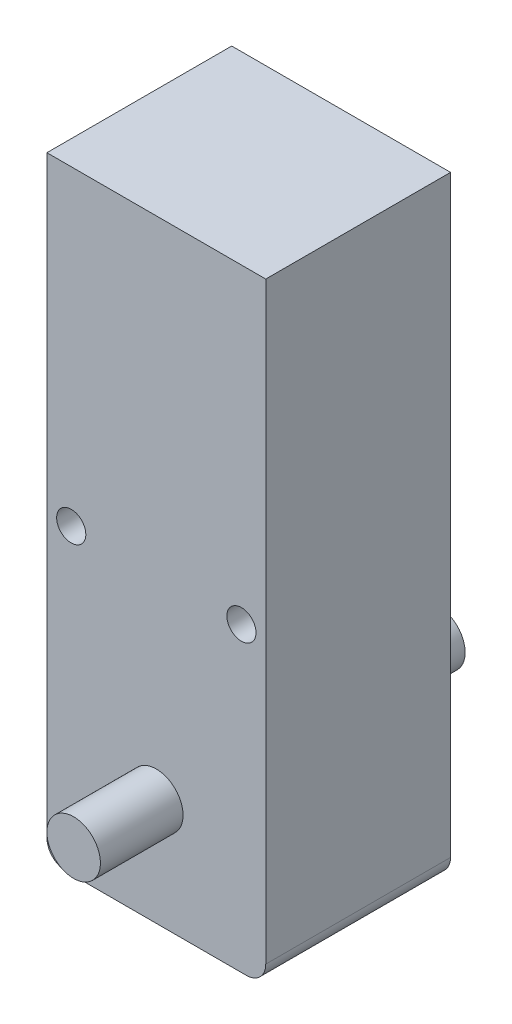
ISO-10303-21;
HEADER;
FILE_DESCRIPTION(('STEP AP214'),'2;1');
FILE_NAME('part.step','',(''),(''),'','','');
FILE_SCHEMA(('AUTOMOTIVE_DESIGN { 1 0 10303 214 1 1 1 1 }'));
ENDSEC;
DATA;
#1=APPLICATION_CONTEXT('core data for automotive mechanical design processes');
#2=APPLICATION_PROTOCOL_DEFINITION('international standard','automotive_design',2000,#1);
#3=PRODUCT_CONTEXT('',#1,'mechanical');
#4=PRODUCT('Part','Part','',(#3));
#5=PRODUCT_RELATED_PRODUCT_CATEGORY('part','',(#4));
#6=PRODUCT_DEFINITION_FORMATION('','',#4);
#7=PRODUCT_DEFINITION_CONTEXT('part definition',#1,'design');
#8=PRODUCT_DEFINITION('design','',#6,#7);
#9=PRODUCT_DEFINITION_SHAPE('','',#8);
#10=(LENGTH_UNIT() NAMED_UNIT(*) SI_UNIT(.MILLI.,.METRE.));
#11=(NAMED_UNIT(*) PLANE_ANGLE_UNIT() SI_UNIT($,.RADIAN.));
#12=(NAMED_UNIT(*) SI_UNIT($,.STERADIAN.) SOLID_ANGLE_UNIT());
#13=UNCERTAINTY_MEASURE_WITH_UNIT(LENGTH_MEASURE(1.E-05),#10,'distance_accuracy_value','');
#14=(GEOMETRIC_REPRESENTATION_CONTEXT(3) GLOBAL_UNCERTAINTY_ASSIGNED_CONTEXT((#13)) GLOBAL_UNIT_ASSIGNED_CONTEXT((#10,
#11,#12)) REPRESENTATION_CONTEXT('',''));
#15=CARTESIAN_POINT('',(0.,0.,0.));
#16=DIRECTION('',(0.,0.,1.));
#17=DIRECTION('',(1.,0.,0.));
#18=AXIS2_PLACEMENT_3D('',#15,#16,#17);
#19=CARTESIAN_POINT('',(0.,0.,0.));
#20=DIRECTION('',(0.,-1.,0.));
#21=DIRECTION('',(0.,0.,-1.));
#22=AXIS2_PLACEMENT_3D('',#19,#20,#21);
#23=PLANE('',#22);
#24=DIRECTION('',(-1.,0.,0.));
#25=VECTOR('',#24,1.);
#26=CARTESIAN_POINT('',(0.,0.,-19.));
#27=LINE('',#26,#25);
#28=CARTESIAN_POINT('',(20.5,0.,-19.));
#29=VERTEX_POINT('',#28);
#30=CARTESIAN_POINT('',(2.,0.,-19.));
#31=VERTEX_POINT('',#30);
#32=EDGE_CURVE('E161',#29,#31,#27,.T.);
#33=ORIENTED_EDGE('',*,*,#32,.F.);
#34=DIRECTION('',(0.,0.,-1.));
#35=VECTOR('',#34,1.);
#36=CARTESIAN_POINT('',(20.5,0.,0.));
#37=LINE('',#36,#35);
#38=CARTESIAN_POINT('',(20.5,0.,0.));
#39=VERTEX_POINT('',#38);
#40=EDGE_CURVE('E192',#29,#39,#37,.F.);
#41=ORIENTED_EDGE('',*,*,#40,.T.);
#42=DIRECTION('',(1.,0.,0.));
#43=VECTOR('',#42,1.);
#44=CARTESIAN_POINT('',(0.,0.,0.));
#45=LINE('',#44,#43);
#46=CARTESIAN_POINT('',(2.,0.,0.));
#47=VERTEX_POINT('',#46);
#48=EDGE_CURVE('E156',#47,#39,#45,.T.);
#49=ORIENTED_EDGE('',*,*,#48,.F.);
#50=DIRECTION('',(0.,0.,1.));
#51=VECTOR('',#50,1.);
#52=CARTESIAN_POINT('',(2.,0.,-19.));
#53=LINE('',#52,#51);
#54=EDGE_CURVE('E190',#47,#31,#53,.F.);
#55=ORIENTED_EDGE('',*,*,#54,.T.);
#56=EDGE_LOOP('',(#33,#41,#49,#55));
#57=FACE_BOUND('',#56,.T.);
#58=DIRECTION('',(1.,0.,0.));
#59=VECTOR('',#58,1.);
#60=CARTESIAN_POINT('',(8.75,0.,-10.0178180652475));
#61=LINE('',#60,#59);
#62=CARTESIAN_POINT('',(8.75,0.,-10.0178180652475));
#63=VERTEX_POINT('',#62);
#64=CARTESIAN_POINT('',(13.75,0.,-10.0178180652475));
#65=VERTEX_POINT('',#64);
#66=EDGE_CURVE('E221',#63,#65,#61,.T.);
#67=ORIENTED_EDGE('',*,*,#66,.F.);
#68=DIRECTION('',(0.,0.,-1.));
#69=VECTOR('',#68,1.);
#70=CARTESIAN_POINT('',(8.75,0.,-7.01781806524746));
#71=LINE('',#70,#69);
#72=CARTESIAN_POINT('',(8.75,0.,-7.01781806524746));
#73=VERTEX_POINT('',#72);
#74=EDGE_CURVE('E140',#73,#63,#71,.T.);
#75=ORIENTED_EDGE('',*,*,#74,.F.);
#76=DIRECTION('',(-1.,0.,0.));
#77=VECTOR('',#76,1.);
#78=CARTESIAN_POINT('',(8.75,0.,-7.01781806524746));
#79=LINE('',#78,#77);
#80=CARTESIAN_POINT('',(13.75,0.,-7.01781806524746));
#81=VERTEX_POINT('',#80);
#82=EDGE_CURVE('E136',#81,#73,#79,.T.);
#83=ORIENTED_EDGE('',*,*,#82,.F.);
#84=DIRECTION('',(0.,0.,1.));
#85=VECTOR('',#84,1.);
#86=CARTESIAN_POINT('',(13.75,0.,-7.01781806524746));
#87=LINE('',#86,#85);
#88=EDGE_CURVE('E223',#65,#81,#87,.T.);
#89=ORIENTED_EDGE('',*,*,#88,.F.);
#90=EDGE_LOOP('',(#67,#75,#83,#89));
#91=FACE_BOUND('',#90,.T.);
#92=ADVANCED_FACE('F38',(#57,#91),#23,.T.);
#93=CARTESIAN_POINT('',(0.,63.,0.));
#94=DIRECTION('',(1.,0.,0.));
#95=DIRECTION('',(0.,0.,-1.));
#96=AXIS2_PLACEMENT_3D('',#93,#94,#95);
#97=PLANE('',#96);
#98=DIRECTION('',(0.,-1.,0.));
#99=VECTOR('',#98,1.);
#100=CARTESIAN_POINT('',(0.,63.,-19.));
#101=LINE('',#100,#99);
#102=CARTESIAN_POINT('',(0.,63.,-19.));
#103=VERTEX_POINT('',#102);
#104=CARTESIAN_POINT('',(0.,2.,-19.));
#105=VERTEX_POINT('',#104);
#106=EDGE_CURVE('E167',#103,#105,#101,.T.);
#107=ORIENTED_EDGE('',*,*,#106,.T.);
#108=DIRECTION('',(0.,0.,1.));
#109=VECTOR('',#108,1.);
#110=CARTESIAN_POINT('',(0.,2.,0.));
#111=LINE('',#110,#109);
#112=CARTESIAN_POINT('',(0.,2.,0.));
#113=VERTEX_POINT('',#112);
#114=EDGE_CURVE('E11',#105,#113,#111,.T.);
#115=ORIENTED_EDGE('',*,*,#114,.T.);
#116=DIRECTION('',(0.,-1.,0.));
#117=VECTOR('',#116,1.);
#118=CARTESIAN_POINT('',(0.,63.,0.));
#119=LINE('',#118,#117);
#120=CARTESIAN_POINT('',(0.,63.,0.));
#121=VERTEX_POINT('',#120);
#122=EDGE_CURVE('E180',#121,#113,#119,.T.);
#123=ORIENTED_EDGE('',*,*,#122,.F.);
#124=DIRECTION('',(0.,0.,1.));
#125=VECTOR('',#124,1.);
#126=CARTESIAN_POINT('',(0.,63.,0.));
#127=LINE('',#126,#125);
#128=EDGE_CURVE('E157',#103,#121,#127,.T.);
#129=ORIENTED_EDGE('',*,*,#128,.F.);
#130=EDGE_LOOP('',(#107,#115,#123,#129));
#131=FACE_BOUND('',#130,.T.);
#132=ADVANCED_FACE('F243',(#131),#97,.F.);
#133=CARTESIAN_POINT('',(0.,63.,0.));
#134=DIRECTION('',(0.,0.,-1.));
#135=DIRECTION('',(-1.,0.,0.));
#136=AXIS2_PLACEMENT_3D('',#133,#134,#135);
#137=PLANE('',#136);
#138=CARTESIAN_POINT('',(20.,31.,0.));
#139=DIRECTION('',(0.,0.,1.));
#140=DIRECTION('',(1.,0.,0.));
#141=AXIS2_PLACEMENT_3D('',#138,#139,#140);
#142=CIRCLE('',#141,1.5);
#143=CARTESIAN_POINT('',(21.5,31.,0.));
#144=VERTEX_POINT('',#143);
#145=EDGE_CURVE('E203',#144,#144,#142,.T.);
#146=ORIENTED_EDGE('',*,*,#145,.F.);
#147=EDGE_LOOP('',(#146));
#148=FACE_BOUND('',#147,.T.);
#149=CARTESIAN_POINT('',(2.5,31.,0.));
#150=DIRECTION('',(0.,0.,1.));
#151=DIRECTION('',(1.,0.,0.));
#152=AXIS2_PLACEMENT_3D('',#149,#150,#151);
#153=CIRCLE('',#152,1.5);
#154=CARTESIAN_POINT('',(4.,31.,0.));
#155=VERTEX_POINT('',#154);
#156=EDGE_CURVE('E208',#155,#155,#153,.T.);
#157=ORIENTED_EDGE('',*,*,#156,.F.);
#158=EDGE_LOOP('',(#157));
#159=FACE_BOUND('',#158,.T.);
#160=CARTESIAN_POINT('',(11.25,11.,0.));
#161=DIRECTION('',(0.,0.,-1.));
#162=DIRECTION('',(-1.,0.,0.));
#163=AXIS2_PLACEMENT_3D('',#160,#161,#162);
#164=CIRCLE('',#163,2.75);
#165=CARTESIAN_POINT('',(8.5,11.,0.));
#166=VERTEX_POINT('',#165);
#167=EDGE_CURVE('E153',#166,#166,#164,.T.);
#168=ORIENTED_EDGE('',*,*,#167,.T.);
#169=EDGE_LOOP('',(#168));
#170=FACE_BOUND('',#169,.T.);
#171=ORIENTED_EDGE('',*,*,#48,.T.);
#172=CARTESIAN_POINT('',(20.5,2.,0.));
#173=DIRECTION('',(0.,0.,-1.));
#174=DIRECTION('',(-1.,0.,0.));
#175=AXIS2_PLACEMENT_3D('',#172,#173,#174);
#176=CIRCLE('',#175,2.);
#177=CARTESIAN_POINT('',(22.5,2.,0.));
#178=VERTEX_POINT('',#177);
#179=EDGE_CURVE('E47',#39,#178,#176,.F.);
#180=ORIENTED_EDGE('',*,*,#179,.T.);
#181=DIRECTION('',(0.,-1.,0.));
#182=VECTOR('',#181,1.);
#183=CARTESIAN_POINT('',(22.5,63.,0.));
#184=LINE('',#183,#182);
#185=CARTESIAN_POINT('',(22.5,63.,0.));
#186=VERTEX_POINT('',#185);
#187=EDGE_CURVE('E177',#186,#178,#184,.T.);
#188=ORIENTED_EDGE('',*,*,#187,.F.);
#189=DIRECTION('',(1.,0.,0.));
#190=VECTOR('',#189,1.);
#191=CARTESIAN_POINT('',(0.,63.,0.));
#192=LINE('',#191,#190);
#193=EDGE_CURVE('E160',#121,#186,#192,.T.);
#194=ORIENTED_EDGE('',*,*,#193,.F.);
#195=ORIENTED_EDGE('',*,*,#122,.T.);
#196=CARTESIAN_POINT('',(2.,2.,0.));
#197=DIRECTION('',(0.,0.,-1.));
#198=DIRECTION('',(-1.,0.,0.));
#199=AXIS2_PLACEMENT_3D('',#196,#197,#198);
#200=CIRCLE('',#199,2.);
#201=EDGE_CURVE('E63',#113,#47,#200,.F.);
#202=ORIENTED_EDGE('',*,*,#201,.T.);
#203=EDGE_LOOP('',(#171,#180,#188,#194,#195,#202));
#204=FACE_BOUND('',#203,.T.);
#205=ADVANCED_FACE('F249',(#148,#159,#170,#204),#137,.F.);
#206=CARTESIAN_POINT('',(22.5,63.,0.));
#207=DIRECTION('',(-1.,0.,0.));
#208=DIRECTION('',(0.,0.,1.));
#209=AXIS2_PLACEMENT_3D('',#206,#207,#208);
#210=PLANE('',#209);
#211=ORIENTED_EDGE('',*,*,#187,.T.);
#212=DIRECTION('',(0.,0.,-1.));
#213=VECTOR('',#212,1.);
#214=CARTESIAN_POINT('',(22.5,2.,-19.));
#215=LINE('',#214,#213);
#216=CARTESIAN_POINT('',(22.5,2.,-19.));
#217=VERTEX_POINT('',#216);
#218=EDGE_CURVE('E183',#178,#217,#215,.T.);
#219=ORIENTED_EDGE('',*,*,#218,.T.);
#220=DIRECTION('',(0.,-1.,0.));
#221=VECTOR('',#220,1.);
#222=CARTESIAN_POINT('',(22.5,63.,-19.));
#223=LINE('',#222,#221);
#224=CARTESIAN_POINT('',(22.5,63.,-19.));
#225=VERTEX_POINT('',#224);
#226=EDGE_CURVE('E174',#225,#217,#223,.T.);
#227=ORIENTED_EDGE('',*,*,#226,.F.);
#228=DIRECTION('',(0.,0.,-1.));
#229=VECTOR('',#228,1.);
#230=CARTESIAN_POINT('',(22.5,63.,0.));
#231=LINE('',#230,#229);
#232=EDGE_CURVE('E163',#186,#225,#231,.T.);
#233=ORIENTED_EDGE('',*,*,#232,.F.);
#234=EDGE_LOOP('',(#211,#219,#227,#233));
#235=FACE_BOUND('',#234,.T.);
#236=ADVANCED_FACE('F260',(#235),#210,.F.);
#237=CARTESIAN_POINT('',(0.,63.,-19.));
#238=DIRECTION('',(0.,0.,1.));
#239=DIRECTION('',(1.,0.,0.));
#240=AXIS2_PLACEMENT_3D('',#237,#238,#239);
#241=PLANE('',#240);
#242=CARTESIAN_POINT('',(20.,31.,-19.));
#243=DIRECTION('',(0.,0.,1.));
#244=DIRECTION('',(1.,0.,0.));
#245=AXIS2_PLACEMENT_3D('',#242,#243,#244);
#246=CIRCLE('',#245,1.5);
#247=CARTESIAN_POINT('',(21.5,31.,-19.));
#248=VERTEX_POINT('',#247);
#249=EDGE_CURVE('E42',#248,#248,#246,.T.);
#250=ORIENTED_EDGE('',*,*,#249,.T.);
#251=EDGE_LOOP('',(#250));
#252=FACE_BOUND('',#251,.T.);
#253=CARTESIAN_POINT('',(2.5,31.,-19.));
#254=DIRECTION('',(0.,0.,1.));
#255=DIRECTION('',(1.,0.,0.));
#256=AXIS2_PLACEMENT_3D('',#253,#254,#255);
#257=CIRCLE('',#256,1.5);
#258=CARTESIAN_POINT('',(4.,31.,-19.));
#259=VERTEX_POINT('',#258);
#260=EDGE_CURVE('E201',#259,#259,#257,.T.);
#261=ORIENTED_EDGE('',*,*,#260,.T.);
#262=EDGE_LOOP('',(#261));
#263=FACE_BOUND('',#262,.T.);
#264=CARTESIAN_POINT('',(11.25,11.,-19.));
#265=DIRECTION('',(0.,0.,1.));
#266=DIRECTION('',(1.,0.,0.));
#267=AXIS2_PLACEMENT_3D('',#264,#265,#266);
#268=CIRCLE('',#267,2.75);
#269=CARTESIAN_POINT('',(14.,11.,-19.));
#270=VERTEX_POINT('',#269);
#271=EDGE_CURVE('E152',#270,#270,#268,.T.);
#272=ORIENTED_EDGE('',*,*,#271,.T.);
#273=EDGE_LOOP('',(#272));
#274=FACE_BOUND('',#273,.T.);
#275=ORIENTED_EDGE('',*,*,#226,.T.);
#276=CARTESIAN_POINT('',(20.5,2.,-19.));
#277=DIRECTION('',(0.,0.,1.));
#278=DIRECTION('',(1.,0.,0.));
#279=AXIS2_PLACEMENT_3D('',#276,#277,#278);
#280=CIRCLE('',#279,2.);
#281=EDGE_CURVE('E188',#217,#29,#280,.F.);
#282=ORIENTED_EDGE('',*,*,#281,.T.);
#283=ORIENTED_EDGE('',*,*,#32,.T.);
#284=CARTESIAN_POINT('',(2.,2.,-19.));
#285=DIRECTION('',(0.,0.,1.));
#286=DIRECTION('',(1.,0.,0.));
#287=AXIS2_PLACEMENT_3D('',#284,#285,#286);
#288=CIRCLE('',#287,2.);
#289=EDGE_CURVE('E186',#31,#105,#288,.F.);
#290=ORIENTED_EDGE('',*,*,#289,.T.);
#291=ORIENTED_EDGE('',*,*,#106,.F.);
#292=DIRECTION('',(-1.,0.,0.));
#293=VECTOR('',#292,1.);
#294=CARTESIAN_POINT('',(0.,63.,-19.));
#295=LINE('',#294,#293);
#296=EDGE_CURVE('E165',#225,#103,#295,.T.);
#297=ORIENTED_EDGE('',*,*,#296,.F.);
#298=EDGE_LOOP('',(#275,#282,#283,#290,#291,#297));
#299=FACE_BOUND('',#298,.T.);
#300=ADVANCED_FACE('F257',(#252,#263,#274,#299),#241,.F.);
#301=CARTESIAN_POINT('',(0.,63.,0.));
#302=DIRECTION('',(0.,-1.,0.));
#303=DIRECTION('',(0.,0.,-1.));
#304=AXIS2_PLACEMENT_3D('',#301,#302,#303);
#305=PLANE('',#304);
#306=ORIENTED_EDGE('',*,*,#128,.T.);
#307=ORIENTED_EDGE('',*,*,#193,.T.);
#308=ORIENTED_EDGE('',*,*,#232,.T.);
#309=ORIENTED_EDGE('',*,*,#296,.T.);
#310=EDGE_LOOP('',(#306,#307,#308,#309));
#311=FACE_BOUND('',#310,.T.);
#312=ADVANCED_FACE('F255',(#311),#305,.F.);
#313=CARTESIAN_POINT('',(20.5,2.,0.));
#314=DIRECTION('',(0.,0.,1.));
#315=DIRECTION('',(1.,0.,0.));
#316=AXIS2_PLACEMENT_3D('',#313,#314,#315);
#317=CYLINDRICAL_SURFACE('',#316,2.);
#318=ORIENTED_EDGE('',*,*,#179,.F.);
#319=ORIENTED_EDGE('',*,*,#40,.F.);
#320=ORIENTED_EDGE('',*,*,#281,.F.);
#321=ORIENTED_EDGE('',*,*,#218,.F.);
#322=EDGE_LOOP('',(#318,#319,#320,#321));
#323=FACE_BOUND('',#322,.T.);
#324=ADVANCED_FACE('F267',(#323),#317,.T.);
#325=CARTESIAN_POINT('',(2.,2.,0.));
#326=DIRECTION('',(0.,0.,-1.));
#327=DIRECTION('',(-1.,0.,0.));
#328=AXIS2_PLACEMENT_3D('',#325,#326,#327);
#329=CYLINDRICAL_SURFACE('',#328,2.);
#330=ORIENTED_EDGE('',*,*,#289,.F.);
#331=ORIENTED_EDGE('',*,*,#54,.F.);
#332=ORIENTED_EDGE('',*,*,#201,.F.);
#333=ORIENTED_EDGE('',*,*,#114,.F.);
#334=EDGE_LOOP('',(#330,#331,#332,#333));
#335=FACE_BOUND('',#334,.T.);
#336=ADVANCED_FACE('F40',(#335),#329,.T.);
#337=CARTESIAN_POINT('',(11.25,11.,-29.));
#338=DIRECTION('',(0.,0.,-1.));
#339=DIRECTION('',(-1.,0.,0.));
#340=AXIS2_PLACEMENT_3D('',#337,#338,#339);
#341=PLANE('',#340);
#342=CARTESIAN_POINT('',(11.25,11.,-29.));
#343=DIRECTION('',(0.,0.,-1.));
#344=DIRECTION('',(-1.,0.,0.));
#345=AXIS2_PLACEMENT_3D('',#342,#343,#344);
#346=CIRCLE('',#345,2.75);
#347=CARTESIAN_POINT('',(8.5,11.,-29.));
#348=VERTEX_POINT('',#347);
#349=EDGE_CURVE('E142',#348,#348,#346,.T.);
#350=ORIENTED_EDGE('',*,*,#349,.T.);
#351=EDGE_LOOP('',(#350));
#352=FACE_BOUND('',#351,.T.);
#353=ADVANCED_FACE('F274',(#352),#341,.T.);
#354=CARTESIAN_POINT('',(11.25,11.,8.5));
#355=DIRECTION('',(0.,0.,-1.));
#356=DIRECTION('',(-1.,0.,0.));
#357=AXIS2_PLACEMENT_3D('',#354,#355,#356);
#358=CYLINDRICAL_SURFACE('',#357,2.75);
#359=ORIENTED_EDGE('',*,*,#349,.F.);
#360=EDGE_LOOP('',(#359));
#361=FACE_BOUND('',#360,.T.);
#362=ORIENTED_EDGE('',*,*,#271,.F.);
#363=EDGE_LOOP('',(#362));
#364=FACE_BOUND('',#363,.T.);
#365=ADVANCED_FACE('F337',(#361,#364),#358,.T.);
#366=CARTESIAN_POINT('',(11.25,11.,8.5));
#367=DIRECTION('',(0.,0.,-1.));
#368=DIRECTION('',(-1.,0.,0.));
#369=AXIS2_PLACEMENT_3D('',#366,#367,#368);
#370=CIRCLE('',#369,2.75);
#371=CARTESIAN_POINT('',(8.5,11.,8.5));
#372=VERTEX_POINT('',#371);
#373=EDGE_CURVE('E145',#372,#372,#370,.T.);
#374=ORIENTED_EDGE('',*,*,#373,.T.);
#375=EDGE_LOOP('',(#374));
#376=FACE_BOUND('',#375,.T.);
#377=ORIENTED_EDGE('',*,*,#167,.F.);
#378=EDGE_LOOP('',(#377));
#379=FACE_BOUND('',#378,.T.);
#380=ADVANCED_FACE('F347',(#376,#379),#358,.T.);
#381=CARTESIAN_POINT('',(11.25,11.,8.5));
#382=DIRECTION('',(0.,0.,-1.));
#383=DIRECTION('',(-1.,0.,0.));
#384=AXIS2_PLACEMENT_3D('',#381,#382,#383);
#385=PLANE('',#384);
#386=ORIENTED_EDGE('',*,*,#373,.F.);
#387=EDGE_LOOP('',(#386));
#388=FACE_BOUND('',#387,.T.);
#389=ADVANCED_FACE('F356',(#388),#385,.F.);
#390=CARTESIAN_POINT('',(8.75,-6.,-7.01781806524746));
#391=DIRECTION('',(1.,0.,0.));
#392=DIRECTION('',(0.,0.,-1.));
#393=AXIS2_PLACEMENT_3D('',#390,#391,#392);
#394=PLANE('',#393);
#395=ORIENTED_EDGE('',*,*,#74,.T.);
#396=DIRECTION('',(0.,1.,0.));
#397=VECTOR('',#396,1.);
#398=CARTESIAN_POINT('',(8.75,-6.,-10.0178180652475));
#399=LINE('',#398,#397);
#400=CARTESIAN_POINT('',(8.75,-6.,-10.0178180652475));
#401=VERTEX_POINT('',#400);
#402=EDGE_CURVE('E121',#401,#63,#399,.T.);
#403=ORIENTED_EDGE('',*,*,#402,.F.);
#404=DIRECTION('',(0.,0.,-1.));
#405=VECTOR('',#404,1.);
#406=CARTESIAN_POINT('',(8.75,-6.,-7.01781806524746));
#407=LINE('',#406,#405);
#408=CARTESIAN_POINT('',(8.75,-6.,-7.01781806524746));
#409=VERTEX_POINT('',#408);
#410=EDGE_CURVE('E128',#409,#401,#407,.T.);
#411=ORIENTED_EDGE('',*,*,#410,.F.);
#412=DIRECTION('',(0.,1.,0.));
#413=VECTOR('',#412,1.);
#414=CARTESIAN_POINT('',(8.75,-6.,-7.01781806524746));
#415=LINE('',#414,#413);
#416=EDGE_CURVE('E219',#409,#73,#415,.T.);
#417=ORIENTED_EDGE('',*,*,#416,.T.);
#418=EDGE_LOOP('',(#395,#403,#411,#417));
#419=FACE_BOUND('',#418,.T.);
#420=ADVANCED_FACE('F138',(#419),#394,.F.);
#421=CARTESIAN_POINT('',(8.75,-6.,-10.0178180652475));
#422=DIRECTION('',(0.,0.,1.));
#423=DIRECTION('',(1.,0.,0.));
#424=AXIS2_PLACEMENT_3D('',#421,#422,#423);
#425=PLANE('',#424);
#426=CARTESIAN_POINT('',(11.25,-3.,-10.0178180652475));
#427=DIRECTION('',(0.,0.,-1.));
#428=DIRECTION('',(-1.,0.,0.));
#429=AXIS2_PLACEMENT_3D('',#426,#427,#428);
#430=CIRCLE('',#429,1.5);
#431=CARTESIAN_POINT('',(9.74999999999999,-3.,-10.0178180652475));
#432=VERTEX_POINT('',#431);
#433=EDGE_CURVE('E200',#432,#432,#430,.T.);
#434=ORIENTED_EDGE('',*,*,#433,.F.);
#435=EDGE_LOOP('',(#434));
#436=FACE_BOUND('',#435,.T.);
#437=ORIENTED_EDGE('',*,*,#66,.T.);
#438=DIRECTION('',(0.,1.,0.));
#439=VECTOR('',#438,1.);
#440=CARTESIAN_POINT('',(13.75,-6.,-10.0178180652475));
#441=LINE('',#440,#439);
#442=CARTESIAN_POINT('',(13.75,-6.,-10.0178180652475));
#443=VERTEX_POINT('',#442);
#444=EDGE_CURVE('E124',#443,#65,#441,.T.);
#445=ORIENTED_EDGE('',*,*,#444,.F.);
#446=DIRECTION('',(1.,0.,0.));
#447=VECTOR('',#446,1.);
#448=CARTESIAN_POINT('',(8.75,-6.,-10.0178180652475));
#449=LINE('',#448,#447);
#450=EDGE_CURVE('E117',#401,#443,#449,.T.);
#451=ORIENTED_EDGE('',*,*,#450,.F.);
#452=ORIENTED_EDGE('',*,*,#402,.T.);
#453=EDGE_LOOP('',(#437,#445,#451,#452));
#454=FACE_BOUND('',#453,.T.);
#455=ADVANCED_FACE('F119',(#436,#454),#425,.F.);
#456=CARTESIAN_POINT('',(13.75,-6.,-7.01781806524746));
#457=DIRECTION('',(-1.,0.,0.));
#458=DIRECTION('',(0.,0.,1.));
#459=AXIS2_PLACEMENT_3D('',#456,#457,#458);
#460=PLANE('',#459);
#461=ORIENTED_EDGE('',*,*,#88,.T.);
#462=DIRECTION('',(0.,1.,0.));
#463=VECTOR('',#462,1.);
#464=CARTESIAN_POINT('',(13.75,-6.,-7.01781806524746));
#465=LINE('',#464,#463);
#466=CARTESIAN_POINT('',(13.75,-6.,-7.01781806524746));
#467=VERTEX_POINT('',#466);
#468=EDGE_CURVE('E55',#467,#81,#465,.T.);
#469=ORIENTED_EDGE('',*,*,#468,.F.);
#470=DIRECTION('',(0.,0.,1.));
#471=VECTOR('',#470,1.);
#472=CARTESIAN_POINT('',(13.75,-6.,-7.01781806524746));
#473=LINE('',#472,#471);
#474=EDGE_CURVE('E127',#443,#467,#473,.T.);
#475=ORIENTED_EDGE('',*,*,#474,.F.);
#476=ORIENTED_EDGE('',*,*,#444,.T.);
#477=EDGE_LOOP('',(#461,#469,#475,#476));
#478=FACE_BOUND('',#477,.T.);
#479=ADVANCED_FACE('F230',(#478),#460,.F.);
#480=CARTESIAN_POINT('',(8.75,-6.,-7.01781806524746));
#481=DIRECTION('',(0.,0.,-1.));
#482=DIRECTION('',(-1.,0.,0.));
#483=AXIS2_PLACEMENT_3D('',#480,#481,#482);
#484=PLANE('',#483);
#485=CARTESIAN_POINT('',(11.25,-3.,-7.01781806524746));
#486=DIRECTION('',(0.,0.,-1.));
#487=DIRECTION('',(-1.,0.,0.));
#488=AXIS2_PLACEMENT_3D('',#485,#486,#487);
#489=CIRCLE('',#488,1.5);
#490=CARTESIAN_POINT('',(9.74999999999999,-3.,-7.01781806524746));
#491=VERTEX_POINT('',#490);
#492=EDGE_CURVE('E198',#491,#491,#489,.T.);
#493=ORIENTED_EDGE('',*,*,#492,.T.);
#494=EDGE_LOOP('',(#493));
#495=FACE_BOUND('',#494,.T.);
#496=ORIENTED_EDGE('',*,*,#82,.T.);
#497=ORIENTED_EDGE('',*,*,#416,.F.);
#498=DIRECTION('',(-1.,0.,0.));
#499=VECTOR('',#498,1.);
#500=CARTESIAN_POINT('',(8.75,-6.,-7.01781806524746));
#501=LINE('',#500,#499);
#502=EDGE_CURVE('E132',#467,#409,#501,.T.);
#503=ORIENTED_EDGE('',*,*,#502,.F.);
#504=ORIENTED_EDGE('',*,*,#468,.T.);
#505=EDGE_LOOP('',(#496,#497,#503,#504));
#506=FACE_BOUND('',#505,.T.);
#507=ADVANCED_FACE('F231',(#495,#506),#484,.F.);
#508=CARTESIAN_POINT('',(0.,-6.,0.));
#509=DIRECTION('',(0.,-1.,0.));
#510=DIRECTION('',(0.,0.,-1.));
#511=AXIS2_PLACEMENT_3D('',#508,#509,#510);
#512=PLANE('',#511);
#513=ORIENTED_EDGE('',*,*,#410,.T.);
#514=ORIENTED_EDGE('',*,*,#450,.T.);
#515=ORIENTED_EDGE('',*,*,#474,.T.);
#516=ORIENTED_EDGE('',*,*,#502,.T.);
#517=EDGE_LOOP('',(#513,#514,#515,#516));
#518=FACE_BOUND('',#517,.T.);
#519=ADVANCED_FACE('F131',(#518),#512,.T.);
#520=CARTESIAN_POINT('',(11.25,-3.,-0.0178180652474578));
#521=DIRECTION('',(0.,0.,-1.));
#522=DIRECTION('',(-1.,0.,0.));
#523=AXIS2_PLACEMENT_3D('',#520,#521,#522);
#524=CYLINDRICAL_SURFACE('',#523,1.5);
#525=ORIENTED_EDGE('',*,*,#433,.T.);
#526=EDGE_LOOP('',(#525));
#527=FACE_BOUND('',#526,.T.);
#528=ORIENTED_EDGE('',*,*,#492,.F.);
#529=EDGE_LOOP('',(#528));
#530=FACE_BOUND('',#529,.T.);
#531=ADVANCED_FACE('F239',(#527,#530),#524,.F.);
#532=CARTESIAN_POINT('',(2.5,31.,-29.));
#533=DIRECTION('',(0.,0.,1.));
#534=DIRECTION('',(1.,0.,0.));
#535=AXIS2_PLACEMENT_3D('',#532,#533,#534);
#536=CYLINDRICAL_SURFACE('',#535,1.5);
#537=ORIENTED_EDGE('',*,*,#156,.T.);
#538=EDGE_LOOP('',(#537));
#539=FACE_BOUND('',#538,.T.);
#540=ORIENTED_EDGE('',*,*,#260,.F.);
#541=EDGE_LOOP('',(#540));
#542=FACE_BOUND('',#541,.T.);
#543=ADVANCED_FACE('F406',(#539,#542),#536,.F.);
#544=CARTESIAN_POINT('',(20.,31.,-29.));
#545=DIRECTION('',(0.,0.,1.));
#546=DIRECTION('',(1.,0.,0.));
#547=AXIS2_PLACEMENT_3D('',#544,#545,#546);
#548=CYLINDRICAL_SURFACE('',#547,1.5);
#549=ORIENTED_EDGE('',*,*,#145,.T.);
#550=EDGE_LOOP('',(#549));
#551=FACE_BOUND('',#550,.T.);
#552=ORIENTED_EDGE('',*,*,#249,.F.);
#553=EDGE_LOOP('',(#552));
#554=FACE_BOUND('',#553,.T.);
#555=ADVANCED_FACE('F414',(#551,#554),#548,.F.);
#556=CLOSED_SHELL('',(#92,#132,#205,#236,#300,#312,#324,#336,#353,#365,#380,#389,#420,#455,#479,
#507,#519,#531,#543,#555));
#557=MANIFOLD_SOLID_BREP('B2',#556);
#558=ADVANCED_BREP_SHAPE_REPRESENTATION('',(#18,#557),#14);
#559=SHAPE_DEFINITION_REPRESENTATION(#9,#558);
ENDSEC;
END-ISO-10303-21;
